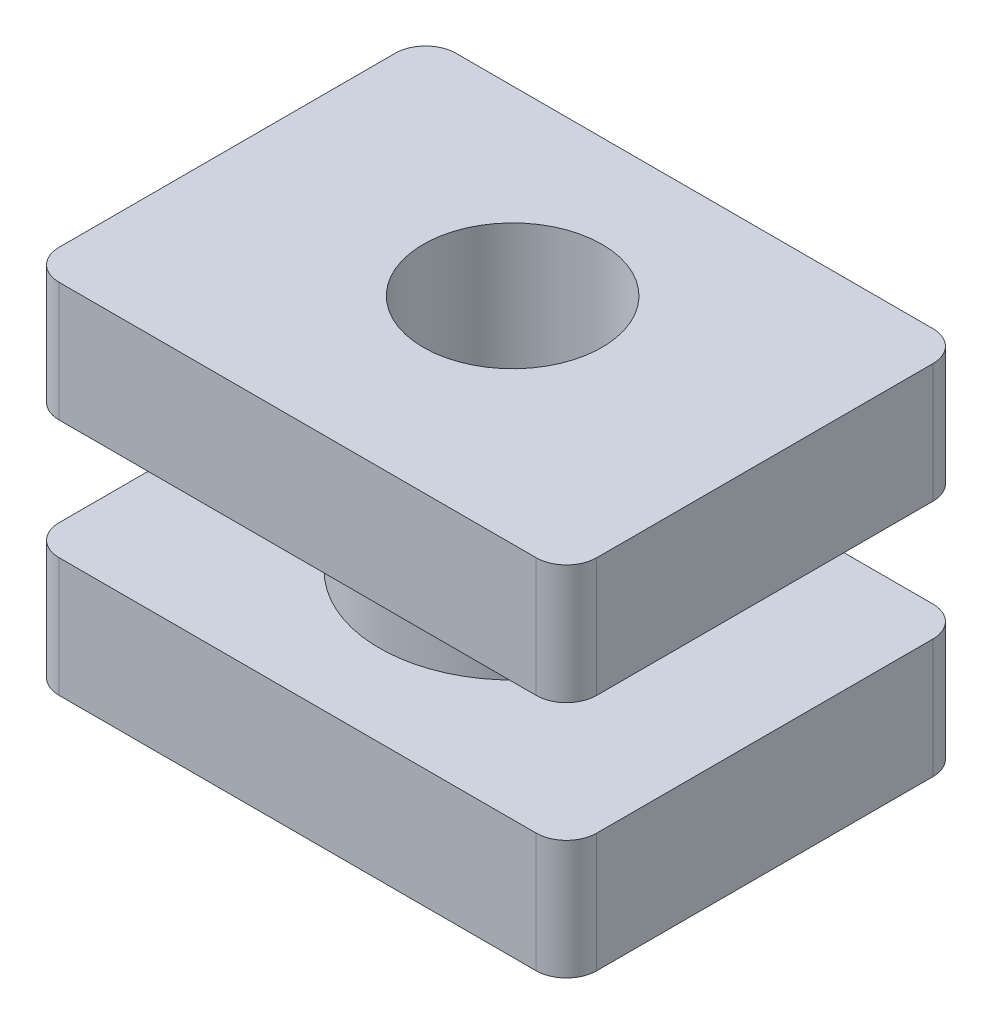
ISO-10303-21;
HEADER;
FILE_DESCRIPTION(('STEP AP214'),'2;1');
FILE_NAME('part.step','',(''),(''),'','','');
FILE_SCHEMA(('AUTOMOTIVE_DESIGN { 1 0 10303 214 1 1 1 1 }'));
ENDSEC;
DATA;
#1=APPLICATION_CONTEXT('core data for automotive mechanical design processes');
#2=APPLICATION_PROTOCOL_DEFINITION('international standard','automotive_design',2000,#1);
#3=PRODUCT_CONTEXT('',#1,'mechanical');
#4=PRODUCT('Part','Part','',(#3));
#5=PRODUCT_RELATED_PRODUCT_CATEGORY('part','',(#4));
#6=PRODUCT_DEFINITION_FORMATION('','',#4);
#7=PRODUCT_DEFINITION_CONTEXT('part definition',#1,'design');
#8=PRODUCT_DEFINITION('design','',#6,#7);
#9=PRODUCT_DEFINITION_SHAPE('','',#8);
#10=(LENGTH_UNIT() NAMED_UNIT(*) SI_UNIT(.MILLI.,.METRE.));
#11=(NAMED_UNIT(*) PLANE_ANGLE_UNIT() SI_UNIT($,.RADIAN.));
#12=(NAMED_UNIT(*) SI_UNIT($,.STERADIAN.) SOLID_ANGLE_UNIT());
#13=UNCERTAINTY_MEASURE_WITH_UNIT(LENGTH_MEASURE(1.E-05),#10,'distance_accuracy_value','');
#14=(GEOMETRIC_REPRESENTATION_CONTEXT(3) GLOBAL_UNCERTAINTY_ASSIGNED_CONTEXT((#13)) GLOBAL_UNIT_ASSIGNED_CONTEXT((#10,
#11,#12)) REPRESENTATION_CONTEXT('',''));
#15=CARTESIAN_POINT('',(0.,0.,0.));
#16=DIRECTION('',(0.,0.,1.));
#17=DIRECTION('',(1.,0.,0.));
#18=AXIS2_PLACEMENT_3D('',#15,#16,#17);
#19=CARTESIAN_POINT('',(2.4003,2.4,-1.43568074279897));
#20=DIRECTION('',(0.,-1.,0.));
#21=DIRECTION('',(0.,0.,-1.));
#22=AXIS2_PLACEMENT_3D('',#19,#20,#21);
#23=PLANE('',#22);
#24=DIRECTION('',(0.,0.,-1.));
#25=VECTOR('',#24,1.);
#26=CARTESIAN_POINT('',(0.89916,2.4,-0.906725540182481));
#27=LINE('',#26,#25);
#28=CARTESIAN_POINT('',(0.899159999999999,2.4,-0.906725540182482));
#29=VERTEX_POINT('',#28);
#30=CARTESIAN_POINT('',(0.89916,2.4,-1.74048074279897));
#31=VERTEX_POINT('',#30);
#32=EDGE_CURVE('E52',#29,#31,#27,.T.);
#33=ORIENTED_EDGE('',*,*,#32,.F.);
#34=CARTESIAN_POINT('',(0.,2.4,0.0883192572010334));
#35=DIRECTION('',(0.,1.,0.));
#36=DIRECTION('',(0.,0.,1.));
#37=AXIS2_PLACEMENT_3D('',#34,#35,#36);
#38=CIRCLE('',#37,1.34112);
#39=CARTESIAN_POINT('',(-0.89916,2.4,-0.906725540182481));
#40=VERTEX_POINT('',#39);
#41=EDGE_CURVE('E200',#40,#29,#38,.T.);
#42=ORIENTED_EDGE('',*,*,#41,.F.);
#43=DIRECTION('',(0.,0.,1.));
#44=VECTOR('',#43,1.);
#45=CARTESIAN_POINT('',(-0.89916,2.4,-0.906725540182481));
#46=LINE('',#45,#44);
#47=CARTESIAN_POINT('',(-0.89916,2.4,-1.74048074279897));
#48=VERTEX_POINT('',#47);
#49=EDGE_CURVE('E58',#48,#40,#46,.T.);
#50=ORIENTED_EDGE('',*,*,#49,.F.);
#51=DIRECTION('',(-1.,0.,0.));
#52=VECTOR('',#51,1.);
#53=CARTESIAN_POINT('',(-2.4003,2.4,-1.74048074279897));
#54=LINE('',#53,#52);
#55=CARTESIAN_POINT('',(-2.4003,2.4,-1.74048074279897));
#56=VERTEX_POINT('',#55);
#57=EDGE_CURVE('E384',#48,#56,#54,.T.);
#58=ORIENTED_EDGE('',*,*,#57,.T.);
#59=CARTESIAN_POINT('',(-2.4003,2.4,-1.43568074279897));
#60=DIRECTION('',(0.,1.,0.));
#61=DIRECTION('',(0.,0.,-1.));
#62=AXIS2_PLACEMENT_3D('',#59,#60,#61);
#63=CIRCLE('',#62,0.3048);
#64=CARTESIAN_POINT('',(-2.7051,2.4,-1.43568074279896));
#65=VERTEX_POINT('',#64);
#66=EDGE_CURVE('E383',#56,#65,#63,.T.);
#67=ORIENTED_EDGE('',*,*,#66,.T.);
#68=DIRECTION('',(0.,0.,1.));
#69=VECTOR('',#68,1.);
#70=CARTESIAN_POINT('',(-2.7051,2.4,-1.43568074279896));
#71=LINE('',#70,#69);
#72=CARTESIAN_POINT('',(-2.7051,2.4,1.94759925720103));
#73=VERTEX_POINT('',#72);
#74=EDGE_CURVE('E390',#65,#73,#71,.T.);
#75=ORIENTED_EDGE('',*,*,#74,.T.);
#76=CARTESIAN_POINT('',(-2.4003,2.4,1.94759925720103));
#77=DIRECTION('',(0.,1.,0.));
#78=DIRECTION('',(0.,0.,-1.));
#79=AXIS2_PLACEMENT_3D('',#76,#77,#78);
#80=CIRCLE('',#79,0.3048);
#81=CARTESIAN_POINT('',(-2.4003,2.4,2.25239925720103));
#82=VERTEX_POINT('',#81);
#83=EDGE_CURVE('E392',#73,#82,#80,.T.);
#84=ORIENTED_EDGE('',*,*,#83,.T.);
#85=DIRECTION('',(1.,0.,0.));
#86=VECTOR('',#85,1.);
#87=CARTESIAN_POINT('',(-2.4003,2.4,2.25239925720103));
#88=LINE('',#87,#86);
#89=CARTESIAN_POINT('',(2.4003,2.4,2.25239925720103));
#90=VERTEX_POINT('',#89);
#91=EDGE_CURVE('E394',#82,#90,#88,.T.);
#92=ORIENTED_EDGE('',*,*,#91,.T.);
#93=CARTESIAN_POINT('',(2.4003,2.4,1.94759925720103));
#94=DIRECTION('',(0.,1.,0.));
#95=DIRECTION('',(0.,0.,-1.));
#96=AXIS2_PLACEMENT_3D('',#93,#94,#95);
#97=CIRCLE('',#96,0.3048);
#98=CARTESIAN_POINT('',(2.7051,2.4,1.94759925720103));
#99=VERTEX_POINT('',#98);
#100=EDGE_CURVE('E395',#90,#99,#97,.T.);
#101=ORIENTED_EDGE('',*,*,#100,.T.);
#102=DIRECTION('',(0.,0.,-1.));
#103=VECTOR('',#102,1.);
#104=CARTESIAN_POINT('',(2.7051,2.4,-1.43568074279896));
#105=LINE('',#104,#103);
#106=CARTESIAN_POINT('',(2.7051,2.4,-1.43568074279896));
#107=VERTEX_POINT('',#106);
#108=EDGE_CURVE('E347',#99,#107,#105,.T.);
#109=ORIENTED_EDGE('',*,*,#108,.T.);
#110=CARTESIAN_POINT('',(2.4003,2.4,-1.43568074279897));
#111=DIRECTION('',(0.,1.,0.));
#112=DIRECTION('',(0.,0.,-1.));
#113=AXIS2_PLACEMENT_3D('',#110,#111,#112);
#114=CIRCLE('',#113,0.3048);
#115=CARTESIAN_POINT('',(2.4003,2.4,-1.74048074279897));
#116=VERTEX_POINT('',#115);
#117=EDGE_CURVE('E361',#107,#116,#114,.T.);
#118=ORIENTED_EDGE('',*,*,#117,.T.);
#119=EDGE_CURVE('E380',#116,#31,#54,.T.);
#120=ORIENTED_EDGE('',*,*,#119,.T.);
#121=EDGE_LOOP('',(#33,#42,#50,#58,#67,#75,#84,#92,#101,#109,#118,#120));
#122=FACE_BOUND('',#121,.T.);
#123=ADVANCED_FACE('F35',(#122),#23,.F.);
#124=CARTESIAN_POINT('',(2.4003,1.2,-1.43568074279897));
#125=DIRECTION('',(0.,-1.,0.));
#126=DIRECTION('',(0.,0.,-1.));
#127=AXIS2_PLACEMENT_3D('',#124,#125,#126);
#128=PLANE('',#127);
#129=CARTESIAN_POINT('',(2.4003,1.2,-1.43568074279897));
#130=DIRECTION('',(0.,1.,0.));
#131=DIRECTION('',(0.,0.,-1.));
#132=AXIS2_PLACEMENT_3D('',#129,#130,#131);
#133=CIRCLE('',#132,0.3048);
#134=CARTESIAN_POINT('',(2.7051,1.2,-1.43568074279896));
#135=VERTEX_POINT('',#134);
#136=CARTESIAN_POINT('',(2.4003,1.2,-1.74048074279897));
#137=VERTEX_POINT('',#136);
#138=EDGE_CURVE('E334',#135,#137,#133,.T.);
#139=ORIENTED_EDGE('',*,*,#138,.F.);
#140=DIRECTION('',(0.,0.,-1.));
#141=VECTOR('',#140,1.);
#142=CARTESIAN_POINT('',(2.7051,1.2,-1.43568074279896));
#143=LINE('',#142,#141);
#144=CARTESIAN_POINT('',(2.7051,1.2,1.94759925720103));
#145=VERTEX_POINT('',#144);
#146=EDGE_CURVE('E359',#145,#135,#143,.T.);
#147=ORIENTED_EDGE('',*,*,#146,.F.);
#148=CARTESIAN_POINT('',(2.4003,1.2,1.94759925720103));
#149=DIRECTION('',(0.,1.,0.));
#150=DIRECTION('',(0.,0.,-1.));
#151=AXIS2_PLACEMENT_3D('',#148,#149,#150);
#152=CIRCLE('',#151,0.3048);
#153=CARTESIAN_POINT('',(2.4003,1.2,2.25239925720103));
#154=VERTEX_POINT('',#153);
#155=EDGE_CURVE('E357',#154,#145,#152,.T.);
#156=ORIENTED_EDGE('',*,*,#155,.F.);
#157=DIRECTION('',(1.,0.,0.));
#158=VECTOR('',#157,1.);
#159=CARTESIAN_POINT('',(-2.4003,1.2,2.25239925720103));
#160=LINE('',#159,#158);
#161=CARTESIAN_POINT('',(-2.4003,1.2,2.25239925720103));
#162=VERTEX_POINT('',#161);
#163=EDGE_CURVE('E355',#162,#154,#160,.T.);
#164=ORIENTED_EDGE('',*,*,#163,.F.);
#165=CARTESIAN_POINT('',(-2.4003,1.2,1.94759925720103));
#166=DIRECTION('',(0.,1.,0.));
#167=DIRECTION('',(0.,0.,-1.));
#168=AXIS2_PLACEMENT_3D('',#165,#166,#167);
#169=CIRCLE('',#168,0.3048);
#170=CARTESIAN_POINT('',(-2.7051,1.2,1.94759925720103));
#171=VERTEX_POINT('',#170);
#172=EDGE_CURVE('E353',#171,#162,#169,.T.);
#173=ORIENTED_EDGE('',*,*,#172,.F.);
#174=DIRECTION('',(0.,0.,1.));
#175=VECTOR('',#174,1.);
#176=CARTESIAN_POINT('',(-2.7051,1.2,-1.43568074279896));
#177=LINE('',#176,#175);
#178=CARTESIAN_POINT('',(-2.7051,1.2,-1.43568074279896));
#179=VERTEX_POINT('',#178);
#180=EDGE_CURVE('E351',#179,#171,#177,.T.);
#181=ORIENTED_EDGE('',*,*,#180,.F.);
#182=CARTESIAN_POINT('',(-2.4003,1.2,-1.43568074279897));
#183=DIRECTION('',(0.,1.,0.));
#184=DIRECTION('',(0.,0.,-1.));
#185=AXIS2_PLACEMENT_3D('',#182,#183,#184);
#186=CIRCLE('',#185,0.3048);
#187=CARTESIAN_POINT('',(-2.4003,1.2,-1.74048074279897));
#188=VERTEX_POINT('',#187);
#189=EDGE_CURVE('E342',#188,#179,#186,.T.);
#190=ORIENTED_EDGE('',*,*,#189,.F.);
#191=DIRECTION('',(-1.,0.,0.));
#192=VECTOR('',#191,1.);
#193=CARTESIAN_POINT('',(-2.4003,1.2,-1.74048074279897));
#194=LINE('',#193,#192);
#195=EDGE_CURVE('E339',#137,#188,#194,.T.);
#196=ORIENTED_EDGE('',*,*,#195,.F.);
#197=EDGE_LOOP('',(#139,#147,#156,#164,#173,#181,#190,#196));
#198=FACE_BOUND('',#197,.T.);
#199=CARTESIAN_POINT('',(0.,1.2,0.0883192572010334));
#200=DIRECTION('',(0.,1.,0.));
#201=DIRECTION('',(0.,0.,1.));
#202=AXIS2_PLACEMENT_3D('',#199,#200,#201);
#203=CIRCLE('',#202,0.89916);
#204=CARTESIAN_POINT('',(0.,1.2,0.987479257201033));
#205=VERTEX_POINT('',#204);
#206=EDGE_CURVE('E340',#205,#205,#203,.T.);
#207=ORIENTED_EDGE('',*,*,#206,.T.);
#208=EDGE_LOOP('',(#207));
#209=FACE_BOUND('',#208,.T.);
#210=ADVANCED_FACE('F289',(#198,#209),#128,.T.);
#211=CARTESIAN_POINT('',(2.4003,2.4,-1.43568074279897));
#212=DIRECTION('',(0.,-1.,0.));
#213=DIRECTION('',(0.,0.,-1.));
#214=AXIS2_PLACEMENT_3D('',#211,#212,#213);
#215=CYLINDRICAL_SURFACE('',#214,0.3048);
#216=ORIENTED_EDGE('',*,*,#138,.T.);
#217=DIRECTION('',(0.,-1.,0.));
#218=VECTOR('',#217,1.);
#219=CARTESIAN_POINT('',(2.4003,2.4,-1.74048074279897));
#220=LINE('',#219,#218);
#221=EDGE_CURVE('E11',#116,#137,#220,.T.);
#222=ORIENTED_EDGE('',*,*,#221,.F.);
#223=ORIENTED_EDGE('',*,*,#117,.F.);
#224=DIRECTION('',(0.,-1.,0.));
#225=VECTOR('',#224,1.);
#226=CARTESIAN_POINT('',(2.7051,2.4,-1.43568074279896));
#227=LINE('',#226,#225);
#228=EDGE_CURVE('E337',#107,#135,#227,.T.);
#229=ORIENTED_EDGE('',*,*,#228,.T.);
#230=EDGE_LOOP('',(#216,#222,#223,#229));
#231=FACE_BOUND('',#230,.T.);
#232=ADVANCED_FACE('F37',(#231),#215,.T.);
#233=CARTESIAN_POINT('',(-2.4003,2.4,-1.74048074279897));
#234=DIRECTION('',(0.,0.,1.));
#235=DIRECTION('',(1.,0.,0.));
#236=AXIS2_PLACEMENT_3D('',#233,#234,#235);
#237=PLANE('',#236);
#238=ORIENTED_EDGE('',*,*,#195,.T.);
#239=DIRECTION('',(0.,-1.,0.));
#240=VECTOR('',#239,1.);
#241=CARTESIAN_POINT('',(-2.4003,2.4,-1.74048074279897));
#242=LINE('',#241,#240);
#243=EDGE_CURVE('E44',#56,#188,#242,.T.);
#244=ORIENTED_EDGE('',*,*,#243,.F.);
#245=ORIENTED_EDGE('',*,*,#57,.F.);
#246=DIRECTION('',(0.,-1.,0.));
#247=VECTOR('',#246,1.);
#248=CARTESIAN_POINT('',(-0.89916,3.6,-1.74048074279897));
#249=LINE('',#248,#247);
#250=CARTESIAN_POINT('',(-0.89916,3.6,-1.74048074279897));
#251=VERTEX_POINT('',#250);
#252=EDGE_CURVE('E263',#251,#48,#249,.T.);
#253=ORIENTED_EDGE('',*,*,#252,.F.);
#254=DIRECTION('',(-1.,0.,0.));
#255=VECTOR('',#254,1.);
#256=CARTESIAN_POINT('',(2.4003,3.6,-1.74048074279897));
#257=LINE('',#256,#255);
#258=CARTESIAN_POINT('',(-2.4003,3.6,-1.74048074279897));
#259=VERTEX_POINT('',#258);
#260=EDGE_CURVE('E209',#251,#259,#257,.T.);
#261=ORIENTED_EDGE('',*,*,#260,.T.);
#262=DIRECTION('',(0.,-1.,0.));
#263=VECTOR('',#262,1.);
#264=CARTESIAN_POINT('',(-2.4003,4.8,-1.74048074279897));
#265=LINE('',#264,#263);
#266=CARTESIAN_POINT('',(-2.4003,4.8,-1.74048074279897));
#267=VERTEX_POINT('',#266);
#268=EDGE_CURVE('E216',#267,#259,#265,.T.);
#269=ORIENTED_EDGE('',*,*,#268,.F.);
#270=DIRECTION('',(-1.,0.,0.));
#271=VECTOR('',#270,1.);
#272=CARTESIAN_POINT('',(2.4003,4.8,-1.74048074279897));
#273=LINE('',#272,#271);
#274=CARTESIAN_POINT('',(2.4003,4.8,-1.74048074279897));
#275=VERTEX_POINT('',#274);
#276=EDGE_CURVE('E190',#275,#267,#273,.T.);
#277=ORIENTED_EDGE('',*,*,#276,.F.);
#278=DIRECTION('',(0.,-1.,0.));
#279=VECTOR('',#278,1.);
#280=CARTESIAN_POINT('',(2.4003,4.8,-1.74048074279897));
#281=LINE('',#280,#279);
#282=CARTESIAN_POINT('',(2.4003,3.6,-1.74048074279897));
#283=VERTEX_POINT('',#282);
#284=EDGE_CURVE('E219',#275,#283,#281,.T.);
#285=ORIENTED_EDGE('',*,*,#284,.T.);
#286=CARTESIAN_POINT('',(0.89916,3.6,-1.74048074279897));
#287=VERTEX_POINT('',#286);
#288=EDGE_CURVE('E194',#283,#287,#257,.T.);
#289=ORIENTED_EDGE('',*,*,#288,.T.);
#290=DIRECTION('',(0.,-1.,0.));
#291=VECTOR('',#290,1.);
#292=CARTESIAN_POINT('',(0.89916,3.6,-1.74048074279897));
#293=LINE('',#292,#291);
#294=EDGE_CURVE('E416',#287,#31,#293,.T.);
#295=ORIENTED_EDGE('',*,*,#294,.T.);
#296=ORIENTED_EDGE('',*,*,#119,.F.);
#297=ORIENTED_EDGE('',*,*,#221,.T.);
#298=EDGE_LOOP('',(#238,#244,#245,#253,#261,#269,#277,#285,#289,#295,#296,#297));
#299=FACE_BOUND('',#298,.T.);
#300=ADVANCED_FACE('F261',(#299),#237,.F.);
#301=CARTESIAN_POINT('',(-2.4003,2.4,-1.43568074279897));
#302=DIRECTION('',(0.,-1.,0.));
#303=DIRECTION('',(0.,0.,-1.));
#304=AXIS2_PLACEMENT_3D('',#301,#302,#303);
#305=CYLINDRICAL_SURFACE('',#304,0.3048);
#306=ORIENTED_EDGE('',*,*,#189,.T.);
#307=DIRECTION('',(0.,-1.,0.));
#308=VECTOR('',#307,1.);
#309=CARTESIAN_POINT('',(-2.7051,2.4,-1.43568074279896));
#310=LINE('',#309,#308);
#311=EDGE_CURVE('E375',#65,#179,#310,.T.);
#312=ORIENTED_EDGE('',*,*,#311,.F.);
#313=ORIENTED_EDGE('',*,*,#66,.F.);
#314=ORIENTED_EDGE('',*,*,#243,.T.);
#315=EDGE_LOOP('',(#306,#312,#313,#314));
#316=FACE_BOUND('',#315,.T.);
#317=ADVANCED_FACE('F319',(#316),#305,.T.);
#318=CARTESIAN_POINT('',(-2.7051,2.4,-1.43568074279896));
#319=DIRECTION('',(1.,0.,0.));
#320=DIRECTION('',(0.,0.,-1.));
#321=AXIS2_PLACEMENT_3D('',#318,#319,#320);
#322=PLANE('',#321);
#323=ORIENTED_EDGE('',*,*,#180,.T.);
#324=DIRECTION('',(0.,-1.,0.));
#325=VECTOR('',#324,1.);
#326=CARTESIAN_POINT('',(-2.7051,2.4,1.94759925720103));
#327=LINE('',#326,#325);
#328=EDGE_CURVE('E372',#73,#171,#327,.T.);
#329=ORIENTED_EDGE('',*,*,#328,.F.);
#330=ORIENTED_EDGE('',*,*,#74,.F.);
#331=ORIENTED_EDGE('',*,*,#311,.T.);
#332=EDGE_LOOP('',(#323,#329,#330,#331));
#333=FACE_BOUND('',#332,.T.);
#334=ADVANCED_FACE('F315',(#333),#322,.F.);
#335=CARTESIAN_POINT('',(-2.4003,2.4,1.94759925720103));
#336=DIRECTION('',(0.,-1.,0.));
#337=DIRECTION('',(0.,0.,-1.));
#338=AXIS2_PLACEMENT_3D('',#335,#336,#337);
#339=CYLINDRICAL_SURFACE('',#338,0.3048);
#340=ORIENTED_EDGE('',*,*,#172,.T.);
#341=DIRECTION('',(0.,-1.,0.));
#342=VECTOR('',#341,1.);
#343=CARTESIAN_POINT('',(-2.4003,2.4,2.25239925720103));
#344=LINE('',#343,#342);
#345=EDGE_CURVE('E369',#82,#162,#344,.T.);
#346=ORIENTED_EDGE('',*,*,#345,.F.);
#347=ORIENTED_EDGE('',*,*,#83,.F.);
#348=ORIENTED_EDGE('',*,*,#328,.T.);
#349=EDGE_LOOP('',(#340,#346,#347,#348));
#350=FACE_BOUND('',#349,.T.);
#351=ADVANCED_FACE('F311',(#350),#339,.T.);
#352=CARTESIAN_POINT('',(-2.4003,2.4,2.25239925720103));
#353=DIRECTION('',(0.,0.,-1.));
#354=DIRECTION('',(-1.,0.,0.));
#355=AXIS2_PLACEMENT_3D('',#352,#353,#354);
#356=PLANE('',#355);
#357=ORIENTED_EDGE('',*,*,#163,.T.);
#358=DIRECTION('',(0.,-1.,0.));
#359=VECTOR('',#358,1.);
#360=CARTESIAN_POINT('',(2.4003,2.4,2.25239925720103));
#361=LINE('',#360,#359);
#362=EDGE_CURVE('E366',#90,#154,#361,.T.);
#363=ORIENTED_EDGE('',*,*,#362,.F.);
#364=ORIENTED_EDGE('',*,*,#91,.F.);
#365=ORIENTED_EDGE('',*,*,#345,.T.);
#366=EDGE_LOOP('',(#357,#363,#364,#365));
#367=FACE_BOUND('',#366,.T.);
#368=ADVANCED_FACE('F307',(#367),#356,.F.);
#369=CARTESIAN_POINT('',(2.4003,2.4,1.94759925720103));
#370=DIRECTION('',(0.,-1.,0.));
#371=DIRECTION('',(0.,0.,-1.));
#372=AXIS2_PLACEMENT_3D('',#369,#370,#371);
#373=CYLINDRICAL_SURFACE('',#372,0.3048);
#374=ORIENTED_EDGE('',*,*,#155,.T.);
#375=DIRECTION('',(0.,-1.,0.));
#376=VECTOR('',#375,1.);
#377=CARTESIAN_POINT('',(2.7051,2.4,1.94759925720103));
#378=LINE('',#377,#376);
#379=EDGE_CURVE('E363',#99,#145,#378,.T.);
#380=ORIENTED_EDGE('',*,*,#379,.F.);
#381=ORIENTED_EDGE('',*,*,#100,.F.);
#382=ORIENTED_EDGE('',*,*,#362,.T.);
#383=EDGE_LOOP('',(#374,#380,#381,#382));
#384=FACE_BOUND('',#383,.T.);
#385=ADVANCED_FACE('F303',(#384),#373,.T.);
#386=CARTESIAN_POINT('',(2.7051,2.4,-1.43568074279896));
#387=DIRECTION('',(-1.,0.,0.));
#388=DIRECTION('',(0.,0.,1.));
#389=AXIS2_PLACEMENT_3D('',#386,#387,#388);
#390=PLANE('',#389);
#391=ORIENTED_EDGE('',*,*,#146,.T.);
#392=ORIENTED_EDGE('',*,*,#228,.F.);
#393=ORIENTED_EDGE('',*,*,#108,.F.);
#394=ORIENTED_EDGE('',*,*,#379,.T.);
#395=EDGE_LOOP('',(#391,#392,#393,#394));
#396=FACE_BOUND('',#395,.T.);
#397=ADVANCED_FACE('F300',(#396),#390,.F.);
#398=CARTESIAN_POINT('',(0.,2.4,0.0883192572010334));
#399=DIRECTION('',(0.,-1.,0.));
#400=DIRECTION('',(0.,0.,-1.));
#401=AXIS2_PLACEMENT_3D('',#398,#399,#400);
#402=CYLINDRICAL_SURFACE('',#401,0.89916);
#403=ORIENTED_EDGE('',*,*,#206,.F.);
#404=EDGE_LOOP('',(#403));
#405=FACE_BOUND('',#404,.T.);
#406=CARTESIAN_POINT('',(0.,4.8,0.0883192572010334));
#407=DIRECTION('',(0.,1.,0.));
#408=DIRECTION('',(0.,0.,1.));
#409=AXIS2_PLACEMENT_3D('',#406,#407,#408);
#410=CIRCLE('',#409,0.89916);
#411=CARTESIAN_POINT('',(0.,4.8,0.987479257201033));
#412=VERTEX_POINT('',#411);
#413=EDGE_CURVE('E265',#412,#412,#410,.T.);
#414=ORIENTED_EDGE('',*,*,#413,.T.);
#415=EDGE_LOOP('',(#414));
#416=FACE_BOUND('',#415,.T.);
#417=ADVANCED_FACE('F297',(#405,#416),#402,.F.);
#418=CARTESIAN_POINT('',(-0.89916,3.6,-0.906725540182481));
#419=DIRECTION('',(1.,0.,0.));
#420=DIRECTION('',(0.,0.,-1.));
#421=AXIS2_PLACEMENT_3D('',#418,#419,#420);
#422=PLANE('',#421);
#423=ORIENTED_EDGE('',*,*,#49,.T.);
#424=DIRECTION('',(0.,-1.,0.));
#425=VECTOR('',#424,1.);
#426=CARTESIAN_POINT('',(-0.89916,3.6,-0.906725540182481));
#427=LINE('',#426,#425);
#428=CARTESIAN_POINT('',(-0.89916,3.6,-0.906725540182481));
#429=VERTEX_POINT('',#428);
#430=EDGE_CURVE('E437',#429,#40,#427,.T.);
#431=ORIENTED_EDGE('',*,*,#430,.F.);
#432=DIRECTION('',(0.,0.,1.));
#433=VECTOR('',#432,1.);
#434=CARTESIAN_POINT('',(-0.89916,3.6,-0.906725540182481));
#435=LINE('',#434,#433);
#436=EDGE_CURVE('E423',#251,#429,#435,.T.);
#437=ORIENTED_EDGE('',*,*,#436,.F.);
#438=ORIENTED_EDGE('',*,*,#252,.T.);
#439=EDGE_LOOP('',(#423,#431,#437,#438));
#440=FACE_BOUND('',#439,.T.);
#441=ADVANCED_FACE('F444',(#440),#422,.F.);
#442=CARTESIAN_POINT('',(0.,3.6,0.0883192572010334));
#443=DIRECTION('',(0.,-1.,0.));
#444=DIRECTION('',(0.,0.,-1.));
#445=AXIS2_PLACEMENT_3D('',#442,#443,#444);
#446=CYLINDRICAL_SURFACE('',#445,1.34112);
#447=ORIENTED_EDGE('',*,*,#41,.T.);
#448=DIRECTION('',(0.,-1.,0.));
#449=VECTOR('',#448,1.);
#450=CARTESIAN_POINT('',(0.899159999999999,3.6,-0.906725540182482));
#451=LINE('',#450,#449);
#452=CARTESIAN_POINT('',(0.899159999999999,3.6,-0.906725540182482));
#453=VERTEX_POINT('',#452);
#454=EDGE_CURVE('E422',#453,#29,#451,.T.);
#455=ORIENTED_EDGE('',*,*,#454,.F.);
#456=CARTESIAN_POINT('',(0.,3.6,0.0883192572010334));
#457=DIRECTION('',(0.,1.,0.));
#458=DIRECTION('',(0.,0.,1.));
#459=AXIS2_PLACEMENT_3D('',#456,#457,#458);
#460=CIRCLE('',#459,1.34112);
#461=EDGE_CURVE('E425',#429,#453,#460,.T.);
#462=ORIENTED_EDGE('',*,*,#461,.F.);
#463=ORIENTED_EDGE('',*,*,#430,.T.);
#464=EDGE_LOOP('',(#447,#455,#462,#463));
#465=FACE_BOUND('',#464,.T.);
#466=ADVANCED_FACE('F451',(#465),#446,.T.);
#467=CARTESIAN_POINT('',(0.89916,3.6,-0.906725540182481));
#468=DIRECTION('',(-1.,0.,0.));
#469=DIRECTION('',(0.,0.,1.));
#470=AXIS2_PLACEMENT_3D('',#467,#468,#469);
#471=PLANE('',#470);
#472=ORIENTED_EDGE('',*,*,#32,.T.);
#473=ORIENTED_EDGE('',*,*,#294,.F.);
#474=DIRECTION('',(0.,0.,-1.));
#475=VECTOR('',#474,1.);
#476=CARTESIAN_POINT('',(0.89916,3.6,-0.906725540182481));
#477=LINE('',#476,#475);
#478=EDGE_CURVE('E447',#453,#287,#477,.T.);
#479=ORIENTED_EDGE('',*,*,#478,.F.);
#480=ORIENTED_EDGE('',*,*,#454,.T.);
#481=EDGE_LOOP('',(#472,#473,#479,#480));
#482=FACE_BOUND('',#481,.T.);
#483=ADVANCED_FACE('F419',(#482),#471,.F.);
#484=CARTESIAN_POINT('',(-2.4003,3.6,-1.43568074279897));
#485=DIRECTION('',(0.,1.,0.));
#486=DIRECTION('',(0.,0.,1.));
#487=AXIS2_PLACEMENT_3D('',#484,#485,#486);
#488=PLANE('',#487);
#489=ORIENTED_EDGE('',*,*,#260,.F.);
#490=ORIENTED_EDGE('',*,*,#436,.T.);
#491=ORIENTED_EDGE('',*,*,#461,.T.);
#492=ORIENTED_EDGE('',*,*,#478,.T.);
#493=ORIENTED_EDGE('',*,*,#288,.F.);
#494=CARTESIAN_POINT('',(2.4003,3.6,-1.43568074279897));
#495=DIRECTION('',(0.,1.,0.));
#496=DIRECTION('',(0.,0.,1.));
#497=AXIS2_PLACEMENT_3D('',#494,#495,#496);
#498=CIRCLE('',#497,0.3048);
#499=CARTESIAN_POINT('',(2.7051,3.6,-1.43568074279896));
#500=VERTEX_POINT('',#499);
#501=EDGE_CURVE('E214',#500,#283,#498,.T.);
#502=ORIENTED_EDGE('',*,*,#501,.F.);
#503=DIRECTION('',(0.,0.,-1.));
#504=VECTOR('',#503,1.);
#505=CARTESIAN_POINT('',(2.7051,3.6,1.94759925720103));
#506=LINE('',#505,#504);
#507=CARTESIAN_POINT('',(2.7051,3.6,1.94759925720103));
#508=VERTEX_POINT('',#507);
#509=EDGE_CURVE('E249',#508,#500,#506,.T.);
#510=ORIENTED_EDGE('',*,*,#509,.F.);
#511=CARTESIAN_POINT('',(2.4003,3.6,1.94759925720103));
#512=DIRECTION('',(0.,1.,0.));
#513=DIRECTION('',(0.,0.,1.));
#514=AXIS2_PLACEMENT_3D('',#511,#512,#513);
#515=CIRCLE('',#514,0.3048);
#516=CARTESIAN_POINT('',(2.4003,3.6,2.25239925720103));
#517=VERTEX_POINT('',#516);
#518=EDGE_CURVE('E247',#517,#508,#515,.T.);
#519=ORIENTED_EDGE('',*,*,#518,.F.);
#520=DIRECTION('',(1.,0.,0.));
#521=VECTOR('',#520,1.);
#522=CARTESIAN_POINT('',(-2.4003,3.6,2.25239925720103));
#523=LINE('',#522,#521);
#524=CARTESIAN_POINT('',(-2.4003,3.6,2.25239925720103));
#525=VERTEX_POINT('',#524);
#526=EDGE_CURVE('E237',#525,#517,#523,.T.);
#527=ORIENTED_EDGE('',*,*,#526,.F.);
#528=CARTESIAN_POINT('',(-2.4003,3.6,1.94759925720103));
#529=DIRECTION('',(0.,1.,0.));
#530=DIRECTION('',(0.,0.,1.));
#531=AXIS2_PLACEMENT_3D('',#528,#529,#530);
#532=CIRCLE('',#531,0.3048);
#533=CARTESIAN_POINT('',(-2.7051,3.6,1.94759925720103));
#534=VERTEX_POINT('',#533);
#535=EDGE_CURVE('E245',#534,#525,#532,.T.);
#536=ORIENTED_EDGE('',*,*,#535,.F.);
#537=DIRECTION('',(0.,0.,1.));
#538=VECTOR('',#537,1.);
#539=CARTESIAN_POINT('',(-2.7051,3.6,-1.43568074279896));
#540=LINE('',#539,#538);
#541=CARTESIAN_POINT('',(-2.7051,3.6,-1.43568074279896));
#542=VERTEX_POINT('',#541);
#543=EDGE_CURVE('E251',#542,#534,#540,.T.);
#544=ORIENTED_EDGE('',*,*,#543,.F.);
#545=CARTESIAN_POINT('',(-2.4003,3.6,-1.43568074279897));
#546=DIRECTION('',(0.,1.,0.));
#547=DIRECTION('',(0.,0.,1.));
#548=AXIS2_PLACEMENT_3D('',#545,#546,#547);
#549=CIRCLE('',#548,0.3048);
#550=EDGE_CURVE('E198',#259,#542,#549,.T.);
#551=ORIENTED_EDGE('',*,*,#550,.F.);
#552=EDGE_LOOP('',(#489,#490,#491,#492,#493,#502,#510,#519,#527,#536,#544,#551));
#553=FACE_BOUND('',#552,.T.);
#554=ADVANCED_FACE('F244',(#553),#488,.F.);
#555=CARTESIAN_POINT('',(-2.4003,4.8,-1.43568074279897));
#556=DIRECTION('',(0.,1.,0.));
#557=DIRECTION('',(0.,0.,1.));
#558=AXIS2_PLACEMENT_3D('',#555,#556,#557);
#559=PLANE('',#558);
#560=CARTESIAN_POINT('',(-2.4003,4.8,-1.43568074279897));
#561=DIRECTION('',(0.,1.,0.));
#562=DIRECTION('',(0.,0.,1.));
#563=AXIS2_PLACEMENT_3D('',#560,#561,#562);
#564=CIRCLE('',#563,0.3048);
#565=CARTESIAN_POINT('',(-2.7051,4.8,-1.43568074279896));
#566=VERTEX_POINT('',#565);
#567=EDGE_CURVE('E184',#267,#566,#564,.T.);
#568=ORIENTED_EDGE('',*,*,#567,.T.);
#569=DIRECTION('',(0.,0.,1.));
#570=VECTOR('',#569,1.);
#571=CARTESIAN_POINT('',(-2.7051,4.8,-1.43568074279896));
#572=LINE('',#571,#570);
#573=CARTESIAN_POINT('',(-2.7051,4.8,1.94759925720103));
#574=VERTEX_POINT('',#573);
#575=EDGE_CURVE('E173',#566,#574,#572,.T.);
#576=ORIENTED_EDGE('',*,*,#575,.T.);
#577=CARTESIAN_POINT('',(-2.4003,4.8,1.94759925720103));
#578=DIRECTION('',(0.,1.,0.));
#579=DIRECTION('',(0.,0.,1.));
#580=AXIS2_PLACEMENT_3D('',#577,#578,#579);
#581=CIRCLE('',#580,0.3048);
#582=CARTESIAN_POINT('',(-2.4003,4.8,2.25239925720103));
#583=VERTEX_POINT('',#582);
#584=EDGE_CURVE('E183',#574,#583,#581,.T.);
#585=ORIENTED_EDGE('',*,*,#584,.T.);
#586=DIRECTION('',(1.,0.,0.));
#587=VECTOR('',#586,1.);
#588=CARTESIAN_POINT('',(-2.4003,4.8,2.25239925720103));
#589=LINE('',#588,#587);
#590=CARTESIAN_POINT('',(2.4003,4.8,2.25239925720103));
#591=VERTEX_POINT('',#590);
#592=EDGE_CURVE('E238',#583,#591,#589,.T.);
#593=ORIENTED_EDGE('',*,*,#592,.T.);
#594=CARTESIAN_POINT('',(2.4003,4.8,1.94759925720103));
#595=DIRECTION('',(0.,1.,0.));
#596=DIRECTION('',(0.,0.,1.));
#597=AXIS2_PLACEMENT_3D('',#594,#595,#596);
#598=CIRCLE('',#597,0.3048);
#599=CARTESIAN_POINT('',(2.7051,4.8,1.94759925720103));
#600=VERTEX_POINT('',#599);
#601=EDGE_CURVE('E275',#591,#600,#598,.T.);
#602=ORIENTED_EDGE('',*,*,#601,.T.);
#603=DIRECTION('',(0.,0.,-1.));
#604=VECTOR('',#603,1.);
#605=CARTESIAN_POINT('',(2.7051,4.8,1.94759925720103));
#606=LINE('',#605,#604);
#607=CARTESIAN_POINT('',(2.7051,4.8,-1.43568074279896));
#608=VERTEX_POINT('',#607);
#609=EDGE_CURVE('E273',#600,#608,#606,.T.);
#610=ORIENTED_EDGE('',*,*,#609,.T.);
#611=CARTESIAN_POINT('',(2.4003,4.8,-1.43568074279897));
#612=DIRECTION('',(0.,1.,0.));
#613=DIRECTION('',(0.,0.,1.));
#614=AXIS2_PLACEMENT_3D('',#611,#612,#613);
#615=CIRCLE('',#614,0.3048);
#616=EDGE_CURVE('E271',#608,#275,#615,.T.);
#617=ORIENTED_EDGE('',*,*,#616,.T.);
#618=ORIENTED_EDGE('',*,*,#276,.T.);
#619=EDGE_LOOP('',(#568,#576,#585,#593,#602,#610,#617,#618));
#620=FACE_BOUND('',#619,.T.);
#621=ORIENTED_EDGE('',*,*,#413,.F.);
#622=EDGE_LOOP('',(#621));
#623=FACE_BOUND('',#622,.T.);
#624=ADVANCED_FACE('F187',(#620,#623),#559,.T.);
#625=CARTESIAN_POINT('',(-2.4003,4.8,-1.43568074279897));
#626=DIRECTION('',(0.,-1.,0.));
#627=DIRECTION('',(0.,0.,-1.));
#628=AXIS2_PLACEMENT_3D('',#625,#626,#627);
#629=CYLINDRICAL_SURFACE('',#628,0.3048);
#630=ORIENTED_EDGE('',*,*,#550,.T.);
#631=DIRECTION('',(0.,-1.,0.));
#632=VECTOR('',#631,1.);
#633=CARTESIAN_POINT('',(-2.7051,4.8,-1.43568074279896));
#634=LINE('',#633,#632);
#635=EDGE_CURVE('E177',#566,#542,#634,.T.);
#636=ORIENTED_EDGE('',*,*,#635,.F.);
#637=ORIENTED_EDGE('',*,*,#567,.F.);
#638=ORIENTED_EDGE('',*,*,#268,.T.);
#639=EDGE_LOOP('',(#630,#636,#637,#638));
#640=FACE_BOUND('',#639,.T.);
#641=ADVANCED_FACE('F196',(#640),#629,.T.);
#642=CARTESIAN_POINT('',(-2.7051,4.8,-1.43568074279896));
#643=DIRECTION('',(1.,0.,0.));
#644=DIRECTION('',(0.,0.,-1.));
#645=AXIS2_PLACEMENT_3D('',#642,#643,#644);
#646=PLANE('',#645);
#647=ORIENTED_EDGE('',*,*,#543,.T.);
#648=DIRECTION('',(0.,-1.,0.));
#649=VECTOR('',#648,1.);
#650=CARTESIAN_POINT('',(-2.7051,4.8,1.94759925720103));
#651=LINE('',#650,#649);
#652=EDGE_CURVE('E180',#574,#534,#651,.T.);
#653=ORIENTED_EDGE('',*,*,#652,.F.);
#654=ORIENTED_EDGE('',*,*,#575,.F.);
#655=ORIENTED_EDGE('',*,*,#635,.T.);
#656=EDGE_LOOP('',(#647,#653,#654,#655));
#657=FACE_BOUND('',#656,.T.);
#658=ADVANCED_FACE('F175',(#657),#646,.F.);
#659=CARTESIAN_POINT('',(-2.4003,4.8,1.94759925720103));
#660=DIRECTION('',(0.,-1.,0.));
#661=DIRECTION('',(0.,0.,-1.));
#662=AXIS2_PLACEMENT_3D('',#659,#660,#661);
#663=CYLINDRICAL_SURFACE('',#662,0.3048);
#664=ORIENTED_EDGE('',*,*,#535,.T.);
#665=DIRECTION('',(0.,-1.,0.));
#666=VECTOR('',#665,1.);
#667=CARTESIAN_POINT('',(-2.4003,4.8,2.25239925720103));
#668=LINE('',#667,#666);
#669=EDGE_CURVE('E202',#583,#525,#668,.T.);
#670=ORIENTED_EDGE('',*,*,#669,.F.);
#671=ORIENTED_EDGE('',*,*,#584,.F.);
#672=ORIENTED_EDGE('',*,*,#652,.T.);
#673=EDGE_LOOP('',(#664,#670,#671,#672));
#674=FACE_BOUND('',#673,.T.);
#675=ADVANCED_FACE('F278',(#674),#663,.T.);
#676=CARTESIAN_POINT('',(-2.4003,4.8,2.25239925720103));
#677=DIRECTION('',(0.,0.,-1.));
#678=DIRECTION('',(-1.,0.,0.));
#679=AXIS2_PLACEMENT_3D('',#676,#677,#678);
#680=PLANE('',#679);
#681=ORIENTED_EDGE('',*,*,#526,.T.);
#682=DIRECTION('',(0.,-1.,0.));
#683=VECTOR('',#682,1.);
#684=CARTESIAN_POINT('',(2.4003,4.8,2.25239925720103));
#685=LINE('',#684,#683);
#686=EDGE_CURVE('E228',#591,#517,#685,.T.);
#687=ORIENTED_EDGE('',*,*,#686,.F.);
#688=ORIENTED_EDGE('',*,*,#592,.F.);
#689=ORIENTED_EDGE('',*,*,#669,.T.);
#690=EDGE_LOOP('',(#681,#687,#688,#689));
#691=FACE_BOUND('',#690,.T.);
#692=ADVANCED_FACE('F235',(#691),#680,.F.);
#693=CARTESIAN_POINT('',(2.4003,4.8,1.94759925720103));
#694=DIRECTION('',(0.,-1.,0.));
#695=DIRECTION('',(0.,0.,-1.));
#696=AXIS2_PLACEMENT_3D('',#693,#694,#695);
#697=CYLINDRICAL_SURFACE('',#696,0.3048);
#698=ORIENTED_EDGE('',*,*,#518,.T.);
#699=DIRECTION('',(0.,-1.,0.));
#700=VECTOR('',#699,1.);
#701=CARTESIAN_POINT('',(2.7051,4.8,1.94759925720103));
#702=LINE('',#701,#700);
#703=EDGE_CURVE('E225',#600,#508,#702,.T.);
#704=ORIENTED_EDGE('',*,*,#703,.F.);
#705=ORIENTED_EDGE('',*,*,#601,.F.);
#706=ORIENTED_EDGE('',*,*,#686,.T.);
#707=EDGE_LOOP('',(#698,#704,#705,#706));
#708=FACE_BOUND('',#707,.T.);
#709=ADVANCED_FACE('F285',(#708),#697,.T.);
#710=CARTESIAN_POINT('',(2.7051,4.8,1.94759925720103));
#711=DIRECTION('',(-1.,0.,0.));
#712=DIRECTION('',(0.,0.,1.));
#713=AXIS2_PLACEMENT_3D('',#710,#711,#712);
#714=PLANE('',#713);
#715=ORIENTED_EDGE('',*,*,#509,.T.);
#716=DIRECTION('',(0.,-1.,0.));
#717=VECTOR('',#716,1.);
#718=CARTESIAN_POINT('',(2.7051,4.8,-1.43568074279896));
#719=LINE('',#718,#717);
#720=EDGE_CURVE('E222',#608,#500,#719,.T.);
#721=ORIENTED_EDGE('',*,*,#720,.F.);
#722=ORIENTED_EDGE('',*,*,#609,.F.);
#723=ORIENTED_EDGE('',*,*,#703,.T.);
#724=EDGE_LOOP('',(#715,#721,#722,#723));
#725=FACE_BOUND('',#724,.T.);
#726=ADVANCED_FACE('F473',(#725),#714,.F.);
#727=CARTESIAN_POINT('',(2.4003,4.8,-1.43568074279897));
#728=DIRECTION('',(0.,-1.,0.));
#729=DIRECTION('',(0.,0.,-1.));
#730=AXIS2_PLACEMENT_3D('',#727,#728,#729);
#731=CYLINDRICAL_SURFACE('',#730,0.3048);
#732=ORIENTED_EDGE('',*,*,#501,.T.);
#733=ORIENTED_EDGE('',*,*,#284,.F.);
#734=ORIENTED_EDGE('',*,*,#616,.F.);
#735=ORIENTED_EDGE('',*,*,#720,.T.);
#736=EDGE_LOOP('',(#732,#733,#734,#735));
#737=FACE_BOUND('',#736,.T.);
#738=ADVANCED_FACE('F470',(#737),#731,.T.);
#739=CLOSED_SHELL('',(#123,#210,#232,#300,#317,#334,#351,#368,#385,#397,#417,#441,#466,#483,
#554,#624,#641,#658,#675,#692,#709,#726,#738));
#740=MANIFOLD_SOLID_BREP('B2',#739);
#741=ADVANCED_BREP_SHAPE_REPRESENTATION('',(#18,#740),#14);
#742=SHAPE_DEFINITION_REPRESENTATION(#9,#741);
ENDSEC;
END-ISO-10303-21;
